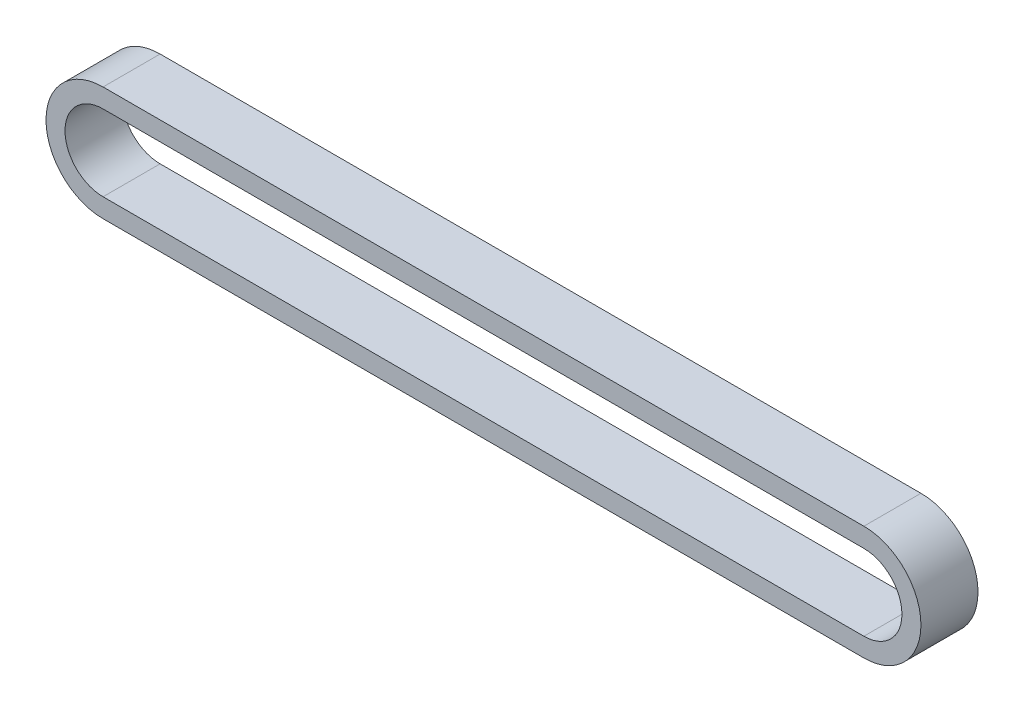
ISO-10303-21;
HEADER;
FILE_DESCRIPTION(('STEP AP214'),'2;1');
FILE_NAME('part.step','',(''),(''),'','','');
FILE_SCHEMA(('AUTOMOTIVE_DESIGN { 1 0 10303 214 1 1 1 1 }'));
ENDSEC;
DATA;
#1=APPLICATION_CONTEXT('core data for automotive mechanical design processes');
#2=APPLICATION_PROTOCOL_DEFINITION('international standard','automotive_design',2000,#1);
#3=PRODUCT_CONTEXT('',#1,'mechanical');
#4=PRODUCT('Part','Part','',(#3));
#5=PRODUCT_RELATED_PRODUCT_CATEGORY('part','',(#4));
#6=PRODUCT_DEFINITION_FORMATION('','',#4);
#7=PRODUCT_DEFINITION_CONTEXT('part definition',#1,'design');
#8=PRODUCT_DEFINITION('design','',#6,#7);
#9=PRODUCT_DEFINITION_SHAPE('','',#8);
#10=(LENGTH_UNIT() NAMED_UNIT(*) SI_UNIT(.MILLI.,.METRE.));
#11=(NAMED_UNIT(*) PLANE_ANGLE_UNIT() SI_UNIT($,.RADIAN.));
#12=(NAMED_UNIT(*) SI_UNIT($,.STERADIAN.) SOLID_ANGLE_UNIT());
#13=UNCERTAINTY_MEASURE_WITH_UNIT(LENGTH_MEASURE(1.E-05),#10,'distance_accuracy_value','');
#14=(GEOMETRIC_REPRESENTATION_CONTEXT(3) GLOBAL_UNCERTAINTY_ASSIGNED_CONTEXT((#13)) GLOBAL_UNIT_ASSIGNED_CONTEXT((#10,
#11,#12)) REPRESENTATION_CONTEXT('',''));
#15=CARTESIAN_POINT('',(0.,0.,0.));
#16=DIRECTION('',(0.,0.,1.));
#17=DIRECTION('',(1.,0.,0.));
#18=AXIS2_PLACEMENT_3D('',#15,#16,#17);
#19=CARTESIAN_POINT('',(-200.,0.0499999999999962,15.));
#20=DIRECTION('',(0.,0.,-1.));
#21=DIRECTION('',(-1.,0.,0.));
#22=AXIS2_PLACEMENT_3D('',#19,#20,#21);
#23=PLANE('',#22);
#24=CARTESIAN_POINT('',(-200.,0.0499999999999962,15.));
#25=DIRECTION('',(0.,0.,1.));
#26=DIRECTION('',(-1.,0.,0.));
#27=AXIS2_PLACEMENT_3D('',#24,#25,#26);
#28=CIRCLE('',#27,15.);
#29=CARTESIAN_POINT('',(-200.,15.05,15.));
#30=VERTEX_POINT('',#29);
#31=CARTESIAN_POINT('',(-200.,-14.95,15.));
#32=VERTEX_POINT('',#31);
#33=EDGE_CURVE('E126',#30,#32,#28,.T.);
#34=ORIENTED_EDGE('',*,*,#33,.T.);
#35=DIRECTION('',(1.,0.,0.));
#36=VECTOR('',#35,1.);
#37=CARTESIAN_POINT('',(-200.,-14.95,15.));
#38=LINE('',#37,#36);
#39=CARTESIAN_POINT('',(0.,-14.95,15.));
#40=VERTEX_POINT('',#39);
#41=EDGE_CURVE('E129',#32,#40,#38,.T.);
#42=ORIENTED_EDGE('',*,*,#41,.T.);
#43=CARTESIAN_POINT('',(0.,0.0499999999999962,15.));
#44=DIRECTION('',(0.,0.,1.));
#45=DIRECTION('',(1.,0.,0.));
#46=AXIS2_PLACEMENT_3D('',#43,#44,#45);
#47=CIRCLE('',#46,15.);
#48=CARTESIAN_POINT('',(0.,15.05,15.));
#49=VERTEX_POINT('',#48);
#50=EDGE_CURVE('E131',#40,#49,#47,.T.);
#51=ORIENTED_EDGE('',*,*,#50,.T.);
#52=DIRECTION('',(-1.,0.,0.));
#53=VECTOR('',#52,1.);
#54=CARTESIAN_POINT('',(-200.,15.05,15.));
#55=LINE('',#54,#53);
#56=EDGE_CURVE('E133',#49,#30,#55,.T.);
#57=ORIENTED_EDGE('',*,*,#56,.T.);
#58=EDGE_LOOP('',(#34,#42,#51,#57));
#59=FACE_BOUND('',#58,.T.);
#60=CARTESIAN_POINT('',(-200.,0.0499999999999962,15.));
#61=DIRECTION('',(0.,0.,1.));
#62=DIRECTION('',(1.,0.,0.));
#63=AXIS2_PLACEMENT_3D('',#60,#61,#62);
#64=CIRCLE('',#63,10.);
#65=CARTESIAN_POINT('',(-199.997500015859,10.0499990625117,15.));
#66=VERTEX_POINT('',#65);
#67=CARTESIAN_POINT('',(-200.002500015547,-9.94999968749612,15.));
#68=VERTEX_POINT('',#67);
#69=EDGE_CURVE('E105',#66,#68,#64,.T.);
#70=ORIENTED_EDGE('',*,*,#69,.F.);
#71=DIRECTION('',(-0.999999968750392,0.000249998429706996,0.));
#72=VECTOR('',#71,1.);
#73=CARTESIAN_POINT('',(-199.997500015859,10.0499990625117,15.));
#74=LINE('',#73,#72);
#75=CARTESIAN_POINT('',(0.,10.,15.));
#76=VERTEX_POINT('',#75);
#77=EDGE_CURVE('E107',#76,#66,#74,.T.);
#78=ORIENTED_EDGE('',*,*,#77,.F.);
#79=CARTESIAN_POINT('',(0.,0.,15.));
#80=DIRECTION('',(0.,0.,1.));
#81=DIRECTION('',(1.,0.,0.));
#82=AXIS2_PLACEMENT_3D('',#79,#80,#81);
#83=CIRCLE('',#82,10.);
#84=CARTESIAN_POINT('',(-0.00249998429707136,-9.99999968750392,15.));
#85=VERTEX_POINT('',#84);
#86=EDGE_CURVE('E106',#85,#76,#83,.T.);
#87=ORIENTED_EDGE('',*,*,#86,.F.);
#88=DIRECTION('',(0.999999968750392,-0.000249998429707136,0.));
#89=VECTOR('',#88,1.);
#90=CARTESIAN_POINT('',(0.,-10.,15.));
#91=LINE('',#90,#89);
#92=EDGE_CURVE('E49',#68,#85,#91,.T.);
#93=ORIENTED_EDGE('',*,*,#92,.F.);
#94=EDGE_LOOP('',(#70,#78,#87,#93));
#95=FACE_BOUND('',#94,.T.);
#96=ADVANCED_FACE('F27',(#59,#95),#23,.F.);
#97=CARTESIAN_POINT('',(-200.,0.0499999999999962,0.));
#98=DIRECTION('',(0.,0.,-1.));
#99=DIRECTION('',(-1.,0.,0.));
#100=AXIS2_PLACEMENT_3D('',#97,#98,#99);
#101=PLANE('',#100);
#102=DIRECTION('',(-0.999999968750392,0.000249998429706996,0.));
#103=VECTOR('',#102,1.);
#104=CARTESIAN_POINT('',(-199.997500015859,10.0499990625117,0.));
#105=LINE('',#104,#103);
#106=CARTESIAN_POINT('',(0.,10.,0.));
#107=VERTEX_POINT('',#106);
#108=CARTESIAN_POINT('',(-199.997500015859,10.0499990625117,0.));
#109=VERTEX_POINT('',#108);
#110=EDGE_CURVE('E99',#107,#109,#105,.T.);
#111=ORIENTED_EDGE('',*,*,#110,.T.);
#112=CARTESIAN_POINT('',(-200.,0.0499999999999962,0.));
#113=DIRECTION('',(0.,0.,1.));
#114=DIRECTION('',(1.,0.,0.));
#115=AXIS2_PLACEMENT_3D('',#112,#113,#114);
#116=CIRCLE('',#115,10.);
#117=CARTESIAN_POINT('',(-200.002500015547,-9.94999968749612,0.));
#118=VERTEX_POINT('',#117);
#119=EDGE_CURVE('E113',#109,#118,#116,.T.);
#120=ORIENTED_EDGE('',*,*,#119,.T.);
#121=DIRECTION('',(0.999999968750392,-0.000249998429707136,0.));
#122=VECTOR('',#121,1.);
#123=CARTESIAN_POINT('',(0.,-10.,0.));
#124=LINE('',#123,#122);
#125=CARTESIAN_POINT('',(-0.00249998421894783,-9.99999937500785,0.));
#126=VERTEX_POINT('',#125);
#127=EDGE_CURVE('E93',#118,#126,#124,.T.);
#128=ORIENTED_EDGE('',*,*,#127,.T.);
#129=CARTESIAN_POINT('',(0.,0.,0.));
#130=DIRECTION('',(0.,0.,1.));
#131=DIRECTION('',(1.,0.,0.));
#132=AXIS2_PLACEMENT_3D('',#129,#130,#131);
#133=CIRCLE('',#132,10.);
#134=EDGE_CURVE('E42',#126,#107,#133,.T.);
#135=ORIENTED_EDGE('',*,*,#134,.T.);
#136=EDGE_LOOP('',(#111,#120,#128,#135));
#137=FACE_BOUND('',#136,.T.);
#138=CARTESIAN_POINT('',(-200.,0.0499999999999962,0.));
#139=DIRECTION('',(0.,0.,1.));
#140=DIRECTION('',(-1.,0.,0.));
#141=AXIS2_PLACEMENT_3D('',#138,#139,#140);
#142=CIRCLE('',#141,15.);
#143=CARTESIAN_POINT('',(-200.,15.05,0.));
#144=VERTEX_POINT('',#143);
#145=CARTESIAN_POINT('',(-200.,-14.95,0.));
#146=VERTEX_POINT('',#145);
#147=EDGE_CURVE('E112',#144,#146,#142,.T.);
#148=ORIENTED_EDGE('',*,*,#147,.F.);
#149=DIRECTION('',(-1.,0.,0.));
#150=VECTOR('',#149,1.);
#151=CARTESIAN_POINT('',(-200.,15.05,0.));
#152=LINE('',#151,#150);
#153=CARTESIAN_POINT('',(0.,15.05,0.));
#154=VERTEX_POINT('',#153);
#155=EDGE_CURVE('E124',#154,#144,#152,.T.);
#156=ORIENTED_EDGE('',*,*,#155,.F.);
#157=CARTESIAN_POINT('',(0.,0.0499999999999962,0.));
#158=DIRECTION('',(0.,0.,1.));
#159=DIRECTION('',(1.,0.,0.));
#160=AXIS2_PLACEMENT_3D('',#157,#158,#159);
#161=CIRCLE('',#160,15.);
#162=CARTESIAN_POINT('',(0.,-14.95,0.));
#163=VERTEX_POINT('',#162);
#164=EDGE_CURVE('E122',#163,#154,#161,.T.);
#165=ORIENTED_EDGE('',*,*,#164,.F.);
#166=DIRECTION('',(1.,0.,0.));
#167=VECTOR('',#166,1.);
#168=CARTESIAN_POINT('',(-200.,-14.95,0.));
#169=LINE('',#168,#167);
#170=EDGE_CURVE('E116',#146,#163,#169,.T.);
#171=ORIENTED_EDGE('',*,*,#170,.F.);
#172=EDGE_LOOP('',(#148,#156,#165,#171));
#173=FACE_BOUND('',#172,.T.);
#174=ADVANCED_FACE('F154',(#137,#173),#101,.T.);
#175=CARTESIAN_POINT('',(-200.,0.0499999999999962,15.));
#176=DIRECTION('',(0.,0.,-1.));
#177=DIRECTION('',(-1.,0.,0.));
#178=AXIS2_PLACEMENT_3D('',#175,#176,#177);
#179=CYLINDRICAL_SURFACE('',#178,15.);
#180=ORIENTED_EDGE('',*,*,#147,.T.);
#181=DIRECTION('',(0.,0.,-1.));
#182=VECTOR('',#181,1.);
#183=CARTESIAN_POINT('',(-200.,-14.95,15.));
#184=LINE('',#183,#182);
#185=EDGE_CURVE('E35',#32,#146,#184,.T.);
#186=ORIENTED_EDGE('',*,*,#185,.F.);
#187=ORIENTED_EDGE('',*,*,#33,.F.);
#188=DIRECTION('',(0.,0.,-1.));
#189=VECTOR('',#188,1.);
#190=CARTESIAN_POINT('',(-200.,15.05,15.));
#191=LINE('',#190,#189);
#192=EDGE_CURVE('E135',#30,#144,#191,.T.);
#193=ORIENTED_EDGE('',*,*,#192,.T.);
#194=EDGE_LOOP('',(#180,#186,#187,#193));
#195=FACE_BOUND('',#194,.T.);
#196=ADVANCED_FACE('F29',(#195),#179,.T.);
#197=CARTESIAN_POINT('',(-200.,-14.95,15.));
#198=DIRECTION('',(0.,1.,0.));
#199=DIRECTION('',(-1.,0.,0.));
#200=AXIS2_PLACEMENT_3D('',#197,#198,#199);
#201=PLANE('',#200);
#202=ORIENTED_EDGE('',*,*,#170,.T.);
#203=DIRECTION('',(0.,0.,-1.));
#204=VECTOR('',#203,1.);
#205=CARTESIAN_POINT('',(0.,-14.95,15.));
#206=LINE('',#205,#204);
#207=EDGE_CURVE('E141',#40,#163,#206,.T.);
#208=ORIENTED_EDGE('',*,*,#207,.F.);
#209=ORIENTED_EDGE('',*,*,#41,.F.);
#210=ORIENTED_EDGE('',*,*,#185,.T.);
#211=EDGE_LOOP('',(#202,#208,#209,#210));
#212=FACE_BOUND('',#211,.T.);
#213=ADVANCED_FACE('F146',(#212),#201,.F.);
#214=CARTESIAN_POINT('',(0.,0.0499999999999962,15.));
#215=DIRECTION('',(0.,0.,-1.));
#216=DIRECTION('',(-1.,0.,0.));
#217=AXIS2_PLACEMENT_3D('',#214,#215,#216);
#218=CYLINDRICAL_SURFACE('',#217,15.);
#219=ORIENTED_EDGE('',*,*,#164,.T.);
#220=DIRECTION('',(0.,0.,-1.));
#221=VECTOR('',#220,1.);
#222=CARTESIAN_POINT('',(0.,15.05,15.));
#223=LINE('',#222,#221);
#224=EDGE_CURVE('E138',#49,#154,#223,.T.);
#225=ORIENTED_EDGE('',*,*,#224,.F.);
#226=ORIENTED_EDGE('',*,*,#50,.F.);
#227=ORIENTED_EDGE('',*,*,#207,.T.);
#228=EDGE_LOOP('',(#219,#225,#226,#227));
#229=FACE_BOUND('',#228,.T.);
#230=ADVANCED_FACE('F158',(#229),#218,.T.);
#231=CARTESIAN_POINT('',(-200.,15.05,15.));
#232=DIRECTION('',(0.,-1.,0.));
#233=DIRECTION('',(0.,0.,-1.));
#234=AXIS2_PLACEMENT_3D('',#231,#232,#233);
#235=PLANE('',#234);
#236=ORIENTED_EDGE('',*,*,#155,.T.);
#237=ORIENTED_EDGE('',*,*,#192,.F.);
#238=ORIENTED_EDGE('',*,*,#56,.F.);
#239=ORIENTED_EDGE('',*,*,#224,.T.);
#240=EDGE_LOOP('',(#236,#237,#238,#239));
#241=FACE_BOUND('',#240,.T.);
#242=ADVANCED_FACE('F162',(#241),#235,.F.);
#243=CARTESIAN_POINT('',(-200.,0.0499999999999962,15.));
#244=DIRECTION('',(0.,0.,-1.));
#245=DIRECTION('',(-1.,0.,0.));
#246=AXIS2_PLACEMENT_3D('',#243,#244,#245);
#247=CYLINDRICAL_SURFACE('',#246,10.);
#248=DIRECTION('',(0.,0.,1.));
#249=VECTOR('',#248,1.);
#250=CARTESIAN_POINT('',(-199.997500015859,10.0499990625117,0.));
#251=LINE('',#250,#249);
#252=EDGE_CURVE('E111',#109,#66,#251,.T.);
#253=ORIENTED_EDGE('',*,*,#252,.T.);
#254=ORIENTED_EDGE('',*,*,#69,.T.);
#255=DIRECTION('',(0.,0.,1.));
#256=VECTOR('',#255,1.);
#257=CARTESIAN_POINT('',(-200.002500015547,-9.94999968749612,0.));
#258=LINE('',#257,#256);
#259=EDGE_CURVE('E91',#118,#68,#258,.T.);
#260=ORIENTED_EDGE('',*,*,#259,.F.);
#261=ORIENTED_EDGE('',*,*,#119,.F.);
#262=EDGE_LOOP('',(#253,#254,#260,#261));
#263=FACE_BOUND('',#262,.T.);
#264=ADVANCED_FACE('F110',(#263),#247,.F.);
#265=CARTESIAN_POINT('',(0.,0.,15.));
#266=DIRECTION('',(0.,0.,-1.));
#267=DIRECTION('',(-1.,0.,0.));
#268=AXIS2_PLACEMENT_3D('',#265,#266,#267);
#269=CYLINDRICAL_SURFACE('',#268,10.);
#270=DIRECTION('',(0.,0.,1.));
#271=VECTOR('',#270,1.);
#272=CARTESIAN_POINT('',(0.,10.,0.));
#273=LINE('',#272,#271);
#274=EDGE_CURVE('E98',#107,#76,#273,.T.);
#275=ORIENTED_EDGE('',*,*,#274,.F.);
#276=ORIENTED_EDGE('',*,*,#134,.F.);
#277=DIRECTION('',(0.,0.,-1.));
#278=VECTOR('',#277,1.);
#279=CARTESIAN_POINT('',(-0.0024999842580096,-9.99999953125589,15.));
#280=LINE('',#279,#278);
#281=EDGE_CURVE('E11',#85,#126,#280,.T.);
#282=ORIENTED_EDGE('',*,*,#281,.F.);
#283=ORIENTED_EDGE('',*,*,#86,.T.);
#284=EDGE_LOOP('',(#275,#276,#282,#283));
#285=FACE_BOUND('',#284,.T.);
#286=ADVANCED_FACE('F201',(#285),#269,.F.);
#287=CARTESIAN_POINT('',(0.,-10.,0.));
#288=DIRECTION('',(-0.000249998429707136,-0.999999968750392,0.));
#289=DIRECTION('',(0.999999968750392,-0.000249998429707136,0.));
#290=AXIS2_PLACEMENT_3D('',#287,#288,#289);
#291=PLANE('',#290);
#292=ORIENTED_EDGE('',*,*,#281,.T.);
#293=ORIENTED_EDGE('',*,*,#127,.F.);
#294=ORIENTED_EDGE('',*,*,#259,.T.);
#295=ORIENTED_EDGE('',*,*,#92,.T.);
#296=EDGE_LOOP('',(#292,#293,#294,#295));
#297=FACE_BOUND('',#296,.T.);
#298=ADVANCED_FACE('F92',(#297),#291,.F.);
#299=CARTESIAN_POINT('',(-199.997500015859,10.0499990625117,0.));
#300=DIRECTION('',(0.000249998429706996,0.999999968750392,0.));
#301=DIRECTION('',(-0.999999968750392,0.000249998429706996,0.));
#302=AXIS2_PLACEMENT_3D('',#299,#300,#301);
#303=PLANE('',#302);
#304=ORIENTED_EDGE('',*,*,#77,.T.);
#305=ORIENTED_EDGE('',*,*,#252,.F.);
#306=ORIENTED_EDGE('',*,*,#110,.F.);
#307=ORIENTED_EDGE('',*,*,#274,.T.);
#308=EDGE_LOOP('',(#304,#305,#306,#307));
#309=FACE_BOUND('',#308,.T.);
#310=ADVANCED_FACE('F214',(#309),#303,.F.);
#311=CLOSED_SHELL('',(#96,#174,#196,#213,#230,#242,#264,#286,#298,#310));
#312=MANIFOLD_SOLID_BREP('B2',#311);
#313=ADVANCED_BREP_SHAPE_REPRESENTATION('',(#18,#312),#14);
#314=SHAPE_DEFINITION_REPRESENTATION(#9,#313);
ENDSEC;
END-ISO-10303-21;
